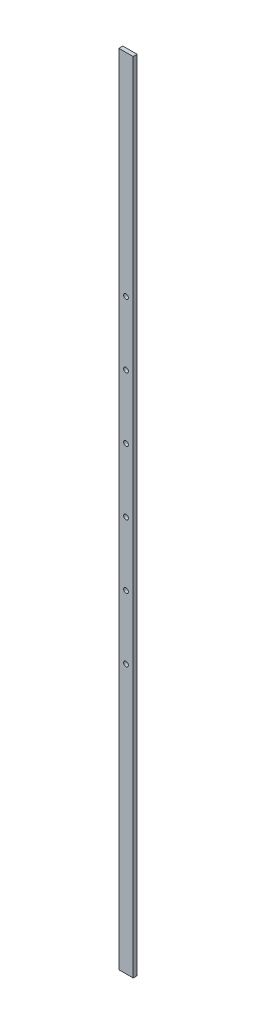
ISO-10303-21;
HEADER;
FILE_DESCRIPTION(('STEP AP214'),'2;1');
FILE_NAME('part.step','',(''),(''),'','','');
FILE_SCHEMA(('AUTOMOTIVE_DESIGN { 1 0 10303 214 1 1 1 1 }'));
ENDSEC;
DATA;
#1=APPLICATION_CONTEXT('core data for automotive mechanical design processes');
#2=APPLICATION_PROTOCOL_DEFINITION('international standard','automotive_design',2000,#1);
#3=PRODUCT_CONTEXT('',#1,'mechanical');
#4=PRODUCT('Part','Part','',(#3));
#5=PRODUCT_RELATED_PRODUCT_CATEGORY('part','',(#4));
#6=PRODUCT_DEFINITION_FORMATION('','',#4);
#7=PRODUCT_DEFINITION_CONTEXT('part definition',#1,'design');
#8=PRODUCT_DEFINITION('design','',#6,#7);
#9=PRODUCT_DEFINITION_SHAPE('','',#8);
#10=(LENGTH_UNIT() NAMED_UNIT(*) SI_UNIT(.MILLI.,.METRE.));
#11=(NAMED_UNIT(*) PLANE_ANGLE_UNIT() SI_UNIT($,.RADIAN.));
#12=(NAMED_UNIT(*) SI_UNIT($,.STERADIAN.) SOLID_ANGLE_UNIT());
#13=UNCERTAINTY_MEASURE_WITH_UNIT(LENGTH_MEASURE(1.E-05),#10,'distance_accuracy_value','');
#14=(GEOMETRIC_REPRESENTATION_CONTEXT(3) GLOBAL_UNCERTAINTY_ASSIGNED_CONTEXT((#13)) GLOBAL_UNIT_ASSIGNED_CONTEXT((#10,
#11,#12)) REPRESENTATION_CONTEXT('',''));
#15=CARTESIAN_POINT('',(0.,0.,0.));
#16=DIRECTION('',(0.,0.,1.));
#17=DIRECTION('',(1.,0.,0.));
#18=AXIS2_PLACEMENT_3D('',#15,#16,#17);
#19=CARTESIAN_POINT('',(0.,-164.15,0.));
#20=DIRECTION('',(0.,0.,1.));
#21=DIRECTION('',(1.,0.,0.));
#22=AXIS2_PLACEMENT_3D('',#19,#20,#21);
#23=CYLINDRICAL_SURFACE('',#22,3.);
#24=CARTESIAN_POINT('',(0.,-164.15,0.));
#25=DIRECTION('',(0.,0.,1.));
#26=DIRECTION('',(1.,0.,0.));
#27=AXIS2_PLACEMENT_3D('',#24,#25,#26);
#28=CIRCLE('',#27,3.);
#29=CARTESIAN_POINT('',(3.00000000000003,-164.15,0.));
#30=VERTEX_POINT('',#29);
#31=EDGE_CURVE('E49',#30,#30,#28,.T.);
#32=ORIENTED_EDGE('',*,*,#31,.F.);
#33=EDGE_LOOP('',(#32));
#34=FACE_BOUND('',#33,.T.);
#35=CARTESIAN_POINT('',(0.,-164.15,5.));
#36=DIRECTION('',(0.,0.,1.));
#37=DIRECTION('',(1.,0.,0.));
#38=AXIS2_PLACEMENT_3D('',#35,#36,#37);
#39=CIRCLE('',#38,3.);
#40=CARTESIAN_POINT('',(2.99999999999997,-164.15,5.00000000000001));
#41=VERTEX_POINT('',#40);
#42=EDGE_CURVE('E11',#41,#41,#39,.T.);
#43=ORIENTED_EDGE('',*,*,#42,.T.);
#44=EDGE_LOOP('',(#43));
#45=FACE_BOUND('',#44,.T.);
#46=ADVANCED_FACE('F40',(#34,#45),#23,.F.);
#47=CARTESIAN_POINT('',(0.,-84.1500000000001,0.));
#48=DIRECTION('',(0.,0.,1.));
#49=DIRECTION('',(1.,0.,0.));
#50=AXIS2_PLACEMENT_3D('',#47,#48,#49);
#51=CYLINDRICAL_SURFACE('',#50,3.);
#52=CARTESIAN_POINT('',(0.,-84.1500000000001,0.));
#53=DIRECTION('',(0.,0.,1.));
#54=DIRECTION('',(1.,0.,0.));
#55=AXIS2_PLACEMENT_3D('',#52,#53,#54);
#56=CIRCLE('',#55,3.);
#57=CARTESIAN_POINT('',(2.99999999999992,-84.1500000000001,0.));
#58=VERTEX_POINT('',#57);
#59=EDGE_CURVE('E147',#58,#58,#56,.T.);
#60=ORIENTED_EDGE('',*,*,#59,.F.);
#61=EDGE_LOOP('',(#60));
#62=FACE_BOUND('',#61,.T.);
#63=CARTESIAN_POINT('',(0.,-84.15,5.00000000000006));
#64=DIRECTION('',(0.,0.,1.));
#65=DIRECTION('',(1.,0.,0.));
#66=AXIS2_PLACEMENT_3D('',#63,#64,#65);
#67=CIRCLE('',#66,3.);
#68=CARTESIAN_POINT('',(2.99999999999995,-84.15,5.00000000000006));
#69=VERTEX_POINT('',#68);
#70=EDGE_CURVE('E151',#69,#69,#67,.T.);
#71=ORIENTED_EDGE('',*,*,#70,.T.);
#72=EDGE_LOOP('',(#71));
#73=FACE_BOUND('',#72,.T.);
#74=ADVANCED_FACE('F163',(#62,#73),#51,.F.);
#75=CARTESIAN_POINT('',(0.,-4.14999999999988,-1.66533453693773E-13));
#76=DIRECTION('',(0.,0.,1.));
#77=DIRECTION('',(1.,0.,0.));
#78=AXIS2_PLACEMENT_3D('',#75,#76,#77);
#79=CYLINDRICAL_SURFACE('',#78,3.);
#80=CARTESIAN_POINT('',(0.,-4.14999999999988,-1.66533453693773E-13));
#81=DIRECTION('',(0.,0.,1.));
#82=DIRECTION('',(1.,0.,0.));
#83=AXIS2_PLACEMENT_3D('',#80,#81,#82);
#84=CIRCLE('',#83,3.);
#85=CARTESIAN_POINT('',(2.99999999999995,-4.14999999999988,-1.65700786425305E-13));
#86=VERTEX_POINT('',#85);
#87=EDGE_CURVE('E139',#86,#86,#84,.T.);
#88=ORIENTED_EDGE('',*,*,#87,.F.);
#89=EDGE_LOOP('',(#88));
#90=FACE_BOUND('',#89,.T.);
#91=CARTESIAN_POINT('',(0.,-4.14999999999999,5.00000000000006));
#92=DIRECTION('',(0.,0.,1.));
#93=DIRECTION('',(1.,0.,0.));
#94=AXIS2_PLACEMENT_3D('',#91,#92,#93);
#95=CIRCLE('',#94,3.);
#96=CARTESIAN_POINT('',(3.,-4.14999999999999,5.00000000000006));
#97=VERTEX_POINT('',#96);
#98=EDGE_CURVE('E143',#97,#97,#95,.T.);
#99=ORIENTED_EDGE('',*,*,#98,.T.);
#100=EDGE_LOOP('',(#99));
#101=FACE_BOUND('',#100,.T.);
#102=ADVANCED_FACE('F194',(#90,#101),#79,.F.);
#103=CARTESIAN_POINT('',(0.,75.8500000000001,0.));
#104=DIRECTION('',(0.,0.,1.));
#105=DIRECTION('',(1.,0.,0.));
#106=AXIS2_PLACEMENT_3D('',#103,#104,#105);
#107=CYLINDRICAL_SURFACE('',#106,3.);
#108=CARTESIAN_POINT('',(0.,75.8500000000001,0.));
#109=DIRECTION('',(0.,0.,1.));
#110=DIRECTION('',(1.,0.,0.));
#111=AXIS2_PLACEMENT_3D('',#108,#109,#110);
#112=CIRCLE('',#111,3.);
#113=CARTESIAN_POINT('',(2.99999999999997,75.8500000000001,0.));
#114=VERTEX_POINT('',#113);
#115=EDGE_CURVE('E131',#114,#114,#112,.T.);
#116=ORIENTED_EDGE('',*,*,#115,.F.);
#117=EDGE_LOOP('',(#116));
#118=FACE_BOUND('',#117,.T.);
#119=CARTESIAN_POINT('',(0.,75.85,4.99999999999995));
#120=DIRECTION('',(0.,0.,1.));
#121=DIRECTION('',(1.,0.,0.));
#122=AXIS2_PLACEMENT_3D('',#119,#120,#121);
#123=CIRCLE('',#122,3.);
#124=CARTESIAN_POINT('',(2.99999999999997,75.85,4.99999999999995));
#125=VERTEX_POINT('',#124);
#126=EDGE_CURVE('E135',#125,#125,#123,.T.);
#127=ORIENTED_EDGE('',*,*,#126,.T.);
#128=EDGE_LOOP('',(#127));
#129=FACE_BOUND('',#128,.T.);
#130=ADVANCED_FACE('F190',(#118,#129),#107,.F.);
#131=CARTESIAN_POINT('',(8.99999999999984,-501.5,4.99999999999995));
#132=DIRECTION('',(-1.,0.,0.));
#133=DIRECTION('',(0.,0.,1.));
#134=AXIS2_PLACEMENT_3D('',#131,#132,#133);
#135=PLANE('',#134);
#136=DIRECTION('',(0.,1.,0.));
#137=VECTOR('',#136,1.);
#138=CARTESIAN_POINT('',(8.9999999999999,-501.5,-1.66533453693773E-13));
#139=LINE('',#138,#137);
#140=CARTESIAN_POINT('',(8.9999999999999,-501.5,-1.66533453693773E-13));
#141=VERTEX_POINT('',#140);
#142=CARTESIAN_POINT('',(9.00000000000001,501.5,0.));
#143=VERTEX_POINT('',#142);
#144=EDGE_CURVE('E114',#141,#143,#139,.T.);
#145=ORIENTED_EDGE('',*,*,#144,.T.);
#146=DIRECTION('',(0.,0.,-1.));
#147=VECTOR('',#146,1.);
#148=CARTESIAN_POINT('',(8.99999999999997,501.5,5.00000000000017));
#149=LINE('',#148,#147);
#150=CARTESIAN_POINT('',(8.99999999999997,501.5,5.00000000000017));
#151=VERTEX_POINT('',#150);
#152=EDGE_CURVE('E102',#151,#143,#149,.T.);
#153=ORIENTED_EDGE('',*,*,#152,.F.);
#154=DIRECTION('',(0.,1.,0.));
#155=VECTOR('',#154,1.);
#156=CARTESIAN_POINT('',(8.99999999999984,-501.5,4.99999999999995));
#157=LINE('',#156,#155);
#158=CARTESIAN_POINT('',(8.99999999999984,-501.5,4.99999999999995));
#159=VERTEX_POINT('',#158);
#160=EDGE_CURVE('E94',#159,#151,#157,.T.);
#161=ORIENTED_EDGE('',*,*,#160,.F.);
#162=DIRECTION('',(0.,0.,-1.));
#163=VECTOR('',#162,1.);
#164=CARTESIAN_POINT('',(8.99999999999984,-501.5,4.99999999999995));
#165=LINE('',#164,#163);
#166=EDGE_CURVE('E110',#159,#141,#165,.T.);
#167=ORIENTED_EDGE('',*,*,#166,.T.);
#168=EDGE_LOOP('',(#145,#153,#161,#167));
#169=FACE_BOUND('',#168,.T.);
#170=ADVANCED_FACE('F187',(#169),#135,.F.);
#171=CARTESIAN_POINT('',(-9.00000000000001,501.5,5.00000000000012));
#172=DIRECTION('',(0.,-1.,0.));
#173=DIRECTION('',(0.,0.,-1.));
#174=AXIS2_PLACEMENT_3D('',#171,#172,#173);
#175=PLANE('',#174);
#176=DIRECTION('',(-1.,0.,0.));
#177=VECTOR('',#176,1.);
#178=CARTESIAN_POINT('',(-9.00000000000002,501.5,1.11022302462516E-13));
#179=LINE('',#178,#177);
#180=CARTESIAN_POINT('',(-9.00000000000002,501.5,1.11022302462516E-13));
#181=VERTEX_POINT('',#180);
#182=EDGE_CURVE('E100',#143,#181,#179,.T.);
#183=ORIENTED_EDGE('',*,*,#182,.T.);
#184=DIRECTION('',(0.,0.,-1.));
#185=VECTOR('',#184,1.);
#186=CARTESIAN_POINT('',(-9.00000000000001,501.5,5.00000000000012));
#187=LINE('',#186,#185);
#188=CARTESIAN_POINT('',(-9.00000000000001,501.5,5.00000000000012));
#189=VERTEX_POINT('',#188);
#190=EDGE_CURVE('E98',#189,#181,#187,.T.);
#191=ORIENTED_EDGE('',*,*,#190,.F.);
#192=DIRECTION('',(-1.,0.,0.));
#193=VECTOR('',#192,1.);
#194=CARTESIAN_POINT('',(-9.00000000000001,501.5,5.00000000000012));
#195=LINE('',#194,#193);
#196=EDGE_CURVE('E88',#151,#189,#195,.T.);
#197=ORIENTED_EDGE('',*,*,#196,.F.);
#198=ORIENTED_EDGE('',*,*,#152,.T.);
#199=EDGE_LOOP('',(#183,#191,#197,#198));
#200=FACE_BOUND('',#199,.T.);
#201=ADVANCED_FACE('F99',(#200),#175,.F.);
#202=CARTESIAN_POINT('',(-9.00000000000009,-501.5,4.99999999999995));
#203=DIRECTION('',(1.,0.,0.));
#204=DIRECTION('',(0.,0.,-1.));
#205=AXIS2_PLACEMENT_3D('',#202,#203,#204);
#206=PLANE('',#205);
#207=DIRECTION('',(0.,-1.,0.));
#208=VECTOR('',#207,1.);
#209=CARTESIAN_POINT('',(-9.00000000000001,-501.5,-1.66533453693773E-13));
#210=LINE('',#209,#208);
#211=CARTESIAN_POINT('',(-9.00000000000001,-501.5,-1.66533453693773E-13));
#212=VERTEX_POINT('',#211);
#213=EDGE_CURVE('E74',#181,#212,#210,.T.);
#214=ORIENTED_EDGE('',*,*,#213,.T.);
#215=DIRECTION('',(0.,0.,-1.));
#216=VECTOR('',#215,1.);
#217=CARTESIAN_POINT('',(-9.00000000000009,-501.5,4.99999999999995));
#218=LINE('',#217,#216);
#219=CARTESIAN_POINT('',(-9.00000000000009,-501.5,4.99999999999995));
#220=VERTEX_POINT('',#219);
#221=EDGE_CURVE('E103',#220,#212,#218,.T.);
#222=ORIENTED_EDGE('',*,*,#221,.F.);
#223=DIRECTION('',(0.,-1.,0.));
#224=VECTOR('',#223,1.);
#225=CARTESIAN_POINT('',(-9.00000000000009,-501.5,4.99999999999995));
#226=LINE('',#225,#224);
#227=EDGE_CURVE('E92',#189,#220,#226,.T.);
#228=ORIENTED_EDGE('',*,*,#227,.F.);
#229=ORIENTED_EDGE('',*,*,#190,.T.);
#230=EDGE_LOOP('',(#214,#222,#228,#229));
#231=FACE_BOUND('',#230,.T.);
#232=ADVANCED_FACE('F105',(#231),#206,.F.);
#233=CARTESIAN_POINT('',(-9.00000000000009,-501.5,4.99999999999995));
#234=DIRECTION('',(0.,1.,0.));
#235=DIRECTION('',(0.,0.,1.));
#236=AXIS2_PLACEMENT_3D('',#233,#234,#235);
#237=PLANE('',#236);
#238=DIRECTION('',(1.,0.,0.));
#239=VECTOR('',#238,1.);
#240=CARTESIAN_POINT('',(-9.00000000000001,-501.5,-1.66533453693773E-13));
#241=LINE('',#240,#239);
#242=EDGE_CURVE('E80',#212,#141,#241,.T.);
#243=ORIENTED_EDGE('',*,*,#242,.T.);
#244=ORIENTED_EDGE('',*,*,#166,.F.);
#245=DIRECTION('',(1.,0.,0.));
#246=VECTOR('',#245,1.);
#247=CARTESIAN_POINT('',(-9.00000000000009,-501.5,4.99999999999995));
#248=LINE('',#247,#246);
#249=EDGE_CURVE('E57',#220,#159,#248,.T.);
#250=ORIENTED_EDGE('',*,*,#249,.F.);
#251=ORIENTED_EDGE('',*,*,#221,.T.);
#252=EDGE_LOOP('',(#243,#244,#250,#251));
#253=FACE_BOUND('',#252,.T.);
#254=ADVANCED_FACE('F167',(#253),#237,.F.);
#255=CARTESIAN_POINT('',(0.,-1.11022302462516E-13,5.));
#256=DIRECTION('',(0.,0.,-1.));
#257=DIRECTION('',(-1.,0.,0.));
#258=AXIS2_PLACEMENT_3D('',#255,#256,#257);
#259=PLANE('',#258);
#260=CARTESIAN_POINT('',(0.,155.85,4.99999999999995));
#261=DIRECTION('',(0.,0.,1.));
#262=DIRECTION('',(1.,0.,0.));
#263=AXIS2_PLACEMENT_3D('',#260,#261,#262);
#264=CIRCLE('',#263,3.);
#265=CARTESIAN_POINT('',(2.99999999999997,155.85,4.99999999999995));
#266=VERTEX_POINT('',#265);
#267=EDGE_CURVE('E309',#266,#266,#264,.T.);
#268=ORIENTED_EDGE('',*,*,#267,.F.);
#269=EDGE_LOOP('',(#268));
#270=FACE_BOUND('',#269,.T.);
#271=CARTESIAN_POINT('',(0.,235.85,5.00000000000006));
#272=DIRECTION('',(0.,0.,1.));
#273=DIRECTION('',(1.,0.,0.));
#274=AXIS2_PLACEMENT_3D('',#271,#272,#273);
#275=CIRCLE('',#274,3.);
#276=CARTESIAN_POINT('',(3.,235.85,5.00000000000006));
#277=VERTEX_POINT('',#276);
#278=EDGE_CURVE('E311',#277,#277,#275,.T.);
#279=ORIENTED_EDGE('',*,*,#278,.F.);
#280=EDGE_LOOP('',(#279));
#281=FACE_BOUND('',#280,.T.);
#282=ORIENTED_EDGE('',*,*,#160,.T.);
#283=ORIENTED_EDGE('',*,*,#196,.T.);
#284=ORIENTED_EDGE('',*,*,#227,.T.);
#285=ORIENTED_EDGE('',*,*,#249,.T.);
#286=EDGE_LOOP('',(#282,#283,#284,#285));
#287=FACE_BOUND('',#286,.T.);
#288=ORIENTED_EDGE('',*,*,#126,.F.);
#289=EDGE_LOOP('',(#288));
#290=FACE_BOUND('',#289,.T.);
#291=ORIENTED_EDGE('',*,*,#98,.F.);
#292=EDGE_LOOP('',(#291));
#293=FACE_BOUND('',#292,.T.);
#294=ORIENTED_EDGE('',*,*,#70,.F.);
#295=EDGE_LOOP('',(#294));
#296=FACE_BOUND('',#295,.T.);
#297=ORIENTED_EDGE('',*,*,#42,.F.);
#298=EDGE_LOOP('',(#297));
#299=FACE_BOUND('',#298,.T.);
#300=ADVANCED_FACE('F89',(#270,#281,#287,#290,#293,#296,#299),#259,.F.);
#301=CARTESIAN_POINT('',(0.,0.,0.));
#302=DIRECTION('',(0.,0.,-1.));
#303=DIRECTION('',(-1.,0.,0.));
#304=AXIS2_PLACEMENT_3D('',#301,#302,#303);
#305=PLANE('',#304);
#306=CARTESIAN_POINT('',(0.,155.85,0.));
#307=DIRECTION('',(0.,0.,1.));
#308=DIRECTION('',(1.,0.,0.));
#309=AXIS2_PLACEMENT_3D('',#306,#307,#308);
#310=CIRCLE('',#309,3.);
#311=CARTESIAN_POINT('',(2.99999999999996,155.85,0.));
#312=VERTEX_POINT('',#311);
#313=EDGE_CURVE('E307',#312,#312,#310,.T.);
#314=ORIENTED_EDGE('',*,*,#313,.T.);
#315=EDGE_LOOP('',(#314));
#316=FACE_BOUND('',#315,.T.);
#317=CARTESIAN_POINT('',(0.,235.85,0.));
#318=DIRECTION('',(0.,0.,1.));
#319=DIRECTION('',(1.,0.,0.));
#320=AXIS2_PLACEMENT_3D('',#317,#318,#319);
#321=CIRCLE('',#320,3.);
#322=CARTESIAN_POINT('',(3.00000000000004,235.85,0.));
#323=VERTEX_POINT('',#322);
#324=EDGE_CURVE('E118',#323,#323,#321,.T.);
#325=ORIENTED_EDGE('',*,*,#324,.T.);
#326=EDGE_LOOP('',(#325));
#327=FACE_BOUND('',#326,.T.);
#328=ORIENTED_EDGE('',*,*,#144,.F.);
#329=ORIENTED_EDGE('',*,*,#242,.F.);
#330=ORIENTED_EDGE('',*,*,#213,.F.);
#331=ORIENTED_EDGE('',*,*,#182,.F.);
#332=EDGE_LOOP('',(#328,#329,#330,#331));
#333=FACE_BOUND('',#332,.T.);
#334=ORIENTED_EDGE('',*,*,#115,.T.);
#335=EDGE_LOOP('',(#334));
#336=FACE_BOUND('',#335,.T.);
#337=ORIENTED_EDGE('',*,*,#87,.T.);
#338=EDGE_LOOP('',(#337));
#339=FACE_BOUND('',#338,.T.);
#340=ORIENTED_EDGE('',*,*,#59,.T.);
#341=EDGE_LOOP('',(#340));
#342=FACE_BOUND('',#341,.T.);
#343=ORIENTED_EDGE('',*,*,#31,.T.);
#344=EDGE_LOOP('',(#343));
#345=FACE_BOUND('',#344,.T.);
#346=ADVANCED_FACE('F159',(#316,#327,#333,#336,#339,#342,#345),#305,.T.);
#347=CARTESIAN_POINT('',(0.,235.85,0.));
#348=DIRECTION('',(0.,0.,1.));
#349=DIRECTION('',(1.,0.,0.));
#350=AXIS2_PLACEMENT_3D('',#347,#348,#349);
#351=CYLINDRICAL_SURFACE('',#350,3.);
#352=ORIENTED_EDGE('',*,*,#324,.F.);
#353=EDGE_LOOP('',(#352));
#354=FACE_BOUND('',#353,.T.);
#355=ORIENTED_EDGE('',*,*,#278,.T.);
#356=EDGE_LOOP('',(#355));
#357=FACE_BOUND('',#356,.T.);
#358=ADVANCED_FACE('F174',(#354,#357),#351,.F.);
#359=CARTESIAN_POINT('',(0.,155.85,0.));
#360=DIRECTION('',(0.,0.,1.));
#361=DIRECTION('',(1.,0.,0.));
#362=AXIS2_PLACEMENT_3D('',#359,#360,#361);
#363=CYLINDRICAL_SURFACE('',#362,3.);
#364=ORIENTED_EDGE('',*,*,#313,.F.);
#365=EDGE_LOOP('',(#364));
#366=FACE_BOUND('',#365,.T.);
#367=ORIENTED_EDGE('',*,*,#267,.T.);
#368=EDGE_LOOP('',(#367));
#369=FACE_BOUND('',#368,.T.);
#370=ADVANCED_FACE('F252',(#366,#369),#363,.F.);
#371=CLOSED_SHELL('',(#46,#74,#102,#130,#170,#201,#232,#254,#300,#346,#358,#370));
#372=MANIFOLD_SOLID_BREP('B2',#371);
#373=ADVANCED_BREP_SHAPE_REPRESENTATION('',(#18,#372),#14);
#374=SHAPE_DEFINITION_REPRESENTATION(#9,#373);
ENDSEC;
END-ISO-10303-21;
